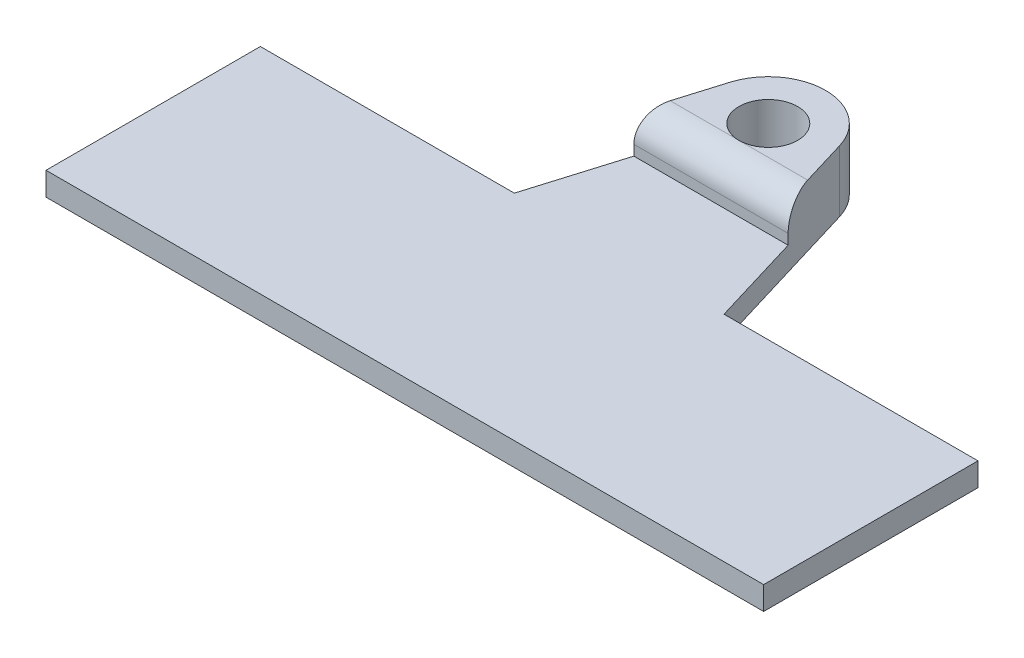
ISO-10303-21;
HEADER;
FILE_DESCRIPTION(('STEP AP214'),'2;1');
FILE_NAME('part.step','',(''),(''),'','','');
FILE_SCHEMA(('AUTOMOTIVE_DESIGN { 1 0 10303 214 1 1 1 1 }'));
ENDSEC;
DATA;
#1=APPLICATION_CONTEXT('core data for automotive mechanical design processes');
#2=APPLICATION_PROTOCOL_DEFINITION('international standard','automotive_design',2000,#1);
#3=PRODUCT_CONTEXT('',#1,'mechanical');
#4=PRODUCT('Part','Part','',(#3));
#5=PRODUCT_RELATED_PRODUCT_CATEGORY('part','',(#4));
#6=PRODUCT_DEFINITION_FORMATION('','',#4);
#7=PRODUCT_DEFINITION_CONTEXT('part definition',#1,'design');
#8=PRODUCT_DEFINITION('design','',#6,#7);
#9=PRODUCT_DEFINITION_SHAPE('','',#8);
#10=(LENGTH_UNIT() NAMED_UNIT(*) SI_UNIT(.MILLI.,.METRE.));
#11=(NAMED_UNIT(*) PLANE_ANGLE_UNIT() SI_UNIT($,.RADIAN.));
#12=(NAMED_UNIT(*) SI_UNIT($,.STERADIAN.) SOLID_ANGLE_UNIT());
#13=UNCERTAINTY_MEASURE_WITH_UNIT(LENGTH_MEASURE(1.E-05),#10,'distance_accuracy_value','');
#14=(GEOMETRIC_REPRESENTATION_CONTEXT(3) GLOBAL_UNCERTAINTY_ASSIGNED_CONTEXT((#13)) GLOBAL_UNIT_ASSIGNED_CONTEXT((#10,
#11,#12)) REPRESENTATION_CONTEXT('',''));
#15=CARTESIAN_POINT('',(0.,0.,0.));
#16=DIRECTION('',(0.,0.,1.));
#17=DIRECTION('',(1.,0.,0.));
#18=AXIS2_PLACEMENT_3D('',#15,#16,#17);
#19=CARTESIAN_POINT('',(-10.3114843961297,6.6,-3.11014044503737));
#20=DIRECTION('',(-0.957398594904213,0.,-0.288769684135018));
#21=DIRECTION('',(-0.288769684135018,0.,0.957398594904213));
#22=AXIS2_PLACEMENT_3D('',#19,#20,#21);
#23=PLANE('',#22);
#24=DIRECTION('',(0.,1.,0.));
#25=VECTOR('',#24,1.);
#26=CARTESIAN_POINT('',(-8.27861415257597,6.60000000000001,-9.85));
#27=LINE('',#26,#25);
#28=CARTESIAN_POINT('',(-8.27861415257597,2.5,-9.85));
#29=VERTEX_POINT('',#28);
#30=CARTESIAN_POINT('',(-8.27861415257597,3.6,-9.85));
#31=VERTEX_POINT('',#30);
#32=EDGE_CURVE('E134',#29,#31,#27,.T.);
#33=ORIENTED_EDGE('',*,*,#32,.T.);
#34=CARTESIAN_POINT('',(-7.37375691023615,3.6,-12.85));
#35=DIRECTION('',(-0.957398594904213,0.,-0.288769684135018));
#36=DIRECTION('',(-0.288769684135018,0.,0.957398594904213));
#37=AXIS2_PLACEMENT_3D('',#34,#35,#36);
#38=ELLIPSE('',#37,3.1334911247704,3.);
#39=CARTESIAN_POINT('',(-7.37375691023613,6.6,-12.85));
#40=VERTEX_POINT('',#39);
#41=EDGE_CURVE('E241',#31,#40,#38,.T.);
#42=ORIENTED_EDGE('',*,*,#41,.T.);
#43=DIRECTION('',(0.288769684135018,0.,-0.957398594904213));
#44=VECTOR('',#43,1.);
#45=CARTESIAN_POINT('',(-10.3114843961297,6.6,-3.11014044503737));
#46=LINE('',#45,#44);
#47=CARTESIAN_POINT('',(-5.88800135866091,6.6,-17.7759335574304));
#48=VERTEX_POINT('',#47);
#49=EDGE_CURVE('E177',#40,#48,#46,.T.);
#50=ORIENTED_EDGE('',*,*,#49,.T.);
#51=DIRECTION('',(0.,-1.,0.));
#52=VECTOR('',#51,1.);
#53=CARTESIAN_POINT('',(-5.88800135866091,6.6,-17.7759335574304));
#54=LINE('',#53,#52);
#55=CARTESIAN_POINT('',(-5.88800135866091,0.,-17.7759335574304));
#56=VERTEX_POINT('',#55);
#57=EDGE_CURVE('E234',#48,#56,#54,.T.);
#58=ORIENTED_EDGE('',*,*,#57,.T.);
#59=DIRECTION('',(0.288769684135018,0.,-0.957398594904213));
#60=VECTOR('',#59,1.);
#61=CARTESIAN_POINT('',(-10.3114843961297,0.,-3.11014044503737));
#62=LINE('',#61,#60);
#63=CARTESIAN_POINT('',(-11.2495620982584,0.,0.));
#64=VERTEX_POINT('',#63);
#65=EDGE_CURVE('E167',#64,#56,#62,.T.);
#66=ORIENTED_EDGE('',*,*,#65,.F.);
#67=DIRECTION('',(0.,-1.,0.));
#68=VECTOR('',#67,1.);
#69=CARTESIAN_POINT('',(-11.2495620982584,6.6,0.));
#70=LINE('',#69,#68);
#71=CARTESIAN_POINT('',(-11.2495620982584,2.5,0.));
#72=VERTEX_POINT('',#71);
#73=EDGE_CURVE('E159',#72,#64,#70,.T.);
#74=ORIENTED_EDGE('',*,*,#73,.F.);
#75=DIRECTION('',(0.288769684135018,0.,-0.957398594904213));
#76=VECTOR('',#75,1.);
#77=CARTESIAN_POINT('',(-10.3114843961297,2.5,-3.11014044503737));
#78=LINE('',#77,#76);
#79=EDGE_CURVE('E150',#72,#29,#78,.T.);
#80=ORIENTED_EDGE('',*,*,#79,.T.);
#81=EDGE_LOOP('',(#33,#42,#50,#58,#66,#74,#80));
#82=FACE_BOUND('',#81,.T.);
#83=ADVANCED_FACE('F46',(#82),#23,.T.);
#84=CARTESIAN_POINT('',(0.,6.6,0.));
#85=DIRECTION('',(0.,0.,-1.));
#86=DIRECTION('',(-1.,0.,0.));
#87=AXIS2_PLACEMENT_3D('',#84,#85,#86);
#88=PLANE('',#87);
#89=DIRECTION('',(0.,-1.,0.));
#90=VECTOR('',#89,1.);
#91=CARTESIAN_POINT('',(-38.5,6.6,0.));
#92=LINE('',#91,#90);
#93=CARTESIAN_POINT('',(-38.5,2.5,0.));
#94=VERTEX_POINT('',#93);
#95=CARTESIAN_POINT('',(-38.5,0.,0.));
#96=VERTEX_POINT('',#95);
#97=EDGE_CURVE('E229',#94,#96,#92,.T.);
#98=ORIENTED_EDGE('',*,*,#97,.F.);
#99=DIRECTION('',(1.,0.,0.));
#100=VECTOR('',#99,1.);
#101=CARTESIAN_POINT('',(0.,2.5,0.));
#102=LINE('',#101,#100);
#103=EDGE_CURVE('E162',#94,#72,#102,.T.);
#104=ORIENTED_EDGE('',*,*,#103,.T.);
#105=ORIENTED_EDGE('',*,*,#73,.T.);
#106=DIRECTION('',(1.,0.,0.));
#107=VECTOR('',#106,1.);
#108=CARTESIAN_POINT('',(0.,0.,0.));
#109=LINE('',#108,#107);
#110=EDGE_CURVE('E191',#96,#64,#109,.T.);
#111=ORIENTED_EDGE('',*,*,#110,.F.);
#112=EDGE_LOOP('',(#98,#104,#105,#111));
#113=FACE_BOUND('',#112,.T.);
#114=ADVANCED_FACE('F274',(#113),#88,.T.);
#115=CARTESIAN_POINT('',(-38.5,6.6,0.));
#116=DIRECTION('',(1.,0.,0.));
#117=DIRECTION('',(0.,0.,-1.));
#118=AXIS2_PLACEMENT_3D('',#115,#116,#117);
#119=PLANE('',#118);
#120=DIRECTION('',(0.,0.,1.));
#121=VECTOR('',#120,1.);
#122=CARTESIAN_POINT('',(-38.5,2.5,0.));
#123=LINE('',#122,#121);
#124=CARTESIAN_POINT('',(-38.5,2.5,23.));
#125=VERTEX_POINT('',#124);
#126=EDGE_CURVE('E169',#94,#125,#123,.T.);
#127=ORIENTED_EDGE('',*,*,#126,.F.);
#128=ORIENTED_EDGE('',*,*,#97,.T.);
#129=DIRECTION('',(0.,0.,1.));
#130=VECTOR('',#129,1.);
#131=CARTESIAN_POINT('',(-38.5,0.,0.));
#132=LINE('',#131,#130);
#133=CARTESIAN_POINT('',(-38.5,0.,23.));
#134=VERTEX_POINT('',#133);
#135=EDGE_CURVE('E195',#96,#134,#132,.T.);
#136=ORIENTED_EDGE('',*,*,#135,.T.);
#137=DIRECTION('',(0.,-1.,0.));
#138=VECTOR('',#137,1.);
#139=CARTESIAN_POINT('',(-38.5,6.6,23.));
#140=LINE('',#139,#138);
#141=EDGE_CURVE('E226',#125,#134,#140,.T.);
#142=ORIENTED_EDGE('',*,*,#141,.F.);
#143=EDGE_LOOP('',(#127,#128,#136,#142));
#144=FACE_BOUND('',#143,.T.);
#145=ADVANCED_FACE('F291',(#144),#119,.F.);
#146=CARTESIAN_POINT('',(38.5,6.6,0.));
#147=DIRECTION('',(1.,0.,0.));
#148=DIRECTION('',(0.,0.,-1.));
#149=AXIS2_PLACEMENT_3D('',#146,#147,#148);
#150=PLANE('',#149);
#151=DIRECTION('',(0.,-1.,0.));
#152=VECTOR('',#151,1.);
#153=CARTESIAN_POINT('',(38.5,6.6,0.));
#154=LINE('',#153,#152);
#155=CARTESIAN_POINT('',(38.5,2.5,0.));
#156=VERTEX_POINT('',#155);
#157=CARTESIAN_POINT('',(38.5,0.,0.));
#158=VERTEX_POINT('',#157);
#159=EDGE_CURVE('E220',#156,#158,#154,.T.);
#160=ORIENTED_EDGE('',*,*,#159,.F.);
#161=DIRECTION('',(0.,0.,1.));
#162=VECTOR('',#161,1.);
#163=CARTESIAN_POINT('',(38.5,2.5,0.));
#164=LINE('',#163,#162);
#165=CARTESIAN_POINT('',(38.5,2.5,23.));
#166=VERTEX_POINT('',#165);
#167=EDGE_CURVE('E264',#156,#166,#164,.T.);
#168=ORIENTED_EDGE('',*,*,#167,.T.);
#169=DIRECTION('',(0.,-1.,0.));
#170=VECTOR('',#169,1.);
#171=CARTESIAN_POINT('',(38.5,6.6,23.));
#172=LINE('',#171,#170);
#173=CARTESIAN_POINT('',(38.5,0.,23.));
#174=VERTEX_POINT('',#173);
#175=EDGE_CURVE('E223',#166,#174,#172,.T.);
#176=ORIENTED_EDGE('',*,*,#175,.T.);
#177=DIRECTION('',(0.,0.,1.));
#178=VECTOR('',#177,1.);
#179=CARTESIAN_POINT('',(38.5,0.,0.));
#180=LINE('',#179,#178);
#181=EDGE_CURVE('E204',#158,#174,#180,.T.);
#182=ORIENTED_EDGE('',*,*,#181,.F.);
#183=EDGE_LOOP('',(#160,#168,#176,#182));
#184=FACE_BOUND('',#183,.T.);
#185=ADVANCED_FACE('F262',(#184),#150,.T.);
#186=DIRECTION('',(0.,-1.,0.));
#187=VECTOR('',#186,1.);
#188=CARTESIAN_POINT('',(11.2495620982584,6.6,0.));
#189=LINE('',#188,#187);
#190=CARTESIAN_POINT('',(11.2495620982584,2.5,0.));
#191=VERTEX_POINT('',#190);
#192=CARTESIAN_POINT('',(11.2495620982584,0.,0.));
#193=VERTEX_POINT('',#192);
#194=EDGE_CURVE('E217',#191,#193,#189,.T.);
#195=ORIENTED_EDGE('',*,*,#194,.F.);
#196=DIRECTION('',(1.,0.,0.));
#197=VECTOR('',#196,1.);
#198=CARTESIAN_POINT('',(0.,2.5,0.));
#199=LINE('',#198,#197);
#200=EDGE_CURVE('E145',#191,#156,#199,.T.);
#201=ORIENTED_EDGE('',*,*,#200,.T.);
#202=ORIENTED_EDGE('',*,*,#159,.T.);
#203=EDGE_CURVE('E196',#193,#158,#109,.T.);
#204=ORIENTED_EDGE('',*,*,#203,.F.);
#205=EDGE_LOOP('',(#195,#201,#202,#204));
#206=FACE_BOUND('',#205,.T.);
#207=ADVANCED_FACE('F257',(#206),#88,.T.);
#208=CARTESIAN_POINT('',(10.3114843961297,6.6,-3.11014044503735));
#209=DIRECTION('',(0.957398594904214,0.,-0.288769684135017));
#210=DIRECTION('',(-0.288769684135017,0.,-0.957398594904214));
#211=AXIS2_PLACEMENT_3D('',#208,#209,#210);
#212=PLANE('',#211);
#213=DIRECTION('',(0.288769684135017,0.,0.957398594904214));
#214=VECTOR('',#213,1.);
#215=CARTESIAN_POINT('',(10.3114843961297,6.6,-3.11014044503735));
#216=LINE('',#215,#214);
#217=CARTESIAN_POINT('',(5.88800135866091,6.6,-17.7759335574304));
#218=VERTEX_POINT('',#217);
#219=CARTESIAN_POINT('',(7.37375691023612,6.6,-12.85));
#220=VERTEX_POINT('',#219);
#221=EDGE_CURVE('E181',#218,#220,#216,.T.);
#222=ORIENTED_EDGE('',*,*,#221,.T.);
#223=CARTESIAN_POINT('',(7.37375691023612,3.6,-12.85));
#224=DIRECTION('',(0.957398594904214,0.,-0.288769684135017));
#225=DIRECTION('',(-0.288769684135017,0.,-0.957398594904214));
#226=AXIS2_PLACEMENT_3D('',#223,#224,#225);
#227=ELLIPSE('',#226,3.1334911247704,3.);
#228=CARTESIAN_POINT('',(8.27861415257595,3.6,-9.85));
#229=VERTEX_POINT('',#228);
#230=EDGE_CURVE('E11',#220,#229,#227,.T.);
#231=ORIENTED_EDGE('',*,*,#230,.T.);
#232=DIRECTION('',(0.,-1.,0.));
#233=VECTOR('',#232,1.);
#234=CARTESIAN_POINT('',(8.27861415257595,6.60000000000001,-9.85));
#235=LINE('',#234,#233);
#236=CARTESIAN_POINT('',(8.27861415257595,2.5,-9.85));
#237=VERTEX_POINT('',#236);
#238=EDGE_CURVE('E146',#229,#237,#235,.T.);
#239=ORIENTED_EDGE('',*,*,#238,.T.);
#240=DIRECTION('',(0.288769684135017,0.,0.957398594904214));
#241=VECTOR('',#240,1.);
#242=CARTESIAN_POINT('',(10.3114843961297,2.5,-3.11014044503735));
#243=LINE('',#242,#241);
#244=EDGE_CURVE('E153',#237,#191,#243,.T.);
#245=ORIENTED_EDGE('',*,*,#244,.T.);
#246=ORIENTED_EDGE('',*,*,#194,.T.);
#247=DIRECTION('',(0.288769684135017,0.,0.957398594904214));
#248=VECTOR('',#247,1.);
#249=CARTESIAN_POINT('',(10.3114843961297,0.,-3.11014044503735));
#250=LINE('',#249,#248);
#251=CARTESIAN_POINT('',(5.88800135866091,0.,-17.7759335574304));
#252=VERTEX_POINT('',#251);
#253=EDGE_CURVE('E208',#252,#193,#250,.T.);
#254=ORIENTED_EDGE('',*,*,#253,.F.);
#255=DIRECTION('',(0.,-1.,0.));
#256=VECTOR('',#255,1.);
#257=CARTESIAN_POINT('',(5.88800135866091,6.6,-17.7759335574304));
#258=LINE('',#257,#256);
#259=EDGE_CURVE('E186',#218,#252,#258,.T.);
#260=ORIENTED_EDGE('',*,*,#259,.F.);
#261=EDGE_LOOP('',(#222,#231,#239,#245,#246,#254,#260));
#262=FACE_BOUND('',#261,.T.);
#263=ADVANCED_FACE('F279',(#262),#212,.T.);
#264=CARTESIAN_POINT('',(0.,6.6,-16.));
#265=DIRECTION('',(0.,-1.,0.));
#266=DIRECTION('',(0.,0.,-1.));
#267=AXIS2_PLACEMENT_3D('',#264,#265,#266);
#268=CYLINDRICAL_SURFACE('',#267,6.15);
#269=CARTESIAN_POINT('',(0.,0.,-16.));
#270=DIRECTION('',(0.,1.,0.));
#271=DIRECTION('',(0.,0.,1.));
#272=AXIS2_PLACEMENT_3D('',#269,#270,#271);
#273=CIRCLE('',#272,6.15);
#274=EDGE_CURVE('E161',#56,#252,#273,.F.);
#275=ORIENTED_EDGE('',*,*,#274,.F.);
#276=ORIENTED_EDGE('',*,*,#57,.F.);
#277=CARTESIAN_POINT('',(0.,6.6,-16.));
#278=DIRECTION('',(0.,1.,0.));
#279=DIRECTION('',(0.,0.,1.));
#280=AXIS2_PLACEMENT_3D('',#277,#278,#279);
#281=CIRCLE('',#280,6.15);
#282=EDGE_CURVE('E173',#48,#218,#281,.F.);
#283=ORIENTED_EDGE('',*,*,#282,.T.);
#284=ORIENTED_EDGE('',*,*,#259,.T.);
#285=EDGE_LOOP('',(#275,#276,#283,#284));
#286=FACE_BOUND('',#285,.T.);
#287=ADVANCED_FACE('F307',(#286),#268,.T.);
#288=CARTESIAN_POINT('',(0.,6.6,23.));
#289=DIRECTION('',(0.,0.,-1.));
#290=DIRECTION('',(-1.,0.,0.));
#291=AXIS2_PLACEMENT_3D('',#288,#289,#290);
#292=PLANE('',#291);
#293=ORIENTED_EDGE('',*,*,#175,.F.);
#294=DIRECTION('',(-1.,0.,0.));
#295=VECTOR('',#294,1.);
#296=CARTESIAN_POINT('',(119.24081509477,2.5,23.));
#297=LINE('',#296,#295);
#298=EDGE_CURVE('E155',#166,#125,#297,.T.);
#299=ORIENTED_EDGE('',*,*,#298,.T.);
#300=ORIENTED_EDGE('',*,*,#141,.T.);
#301=DIRECTION('',(1.,0.,0.));
#302=VECTOR('',#301,1.);
#303=CARTESIAN_POINT('',(0.,0.,23.));
#304=LINE('',#303,#302);
#305=EDGE_CURVE('E200',#134,#174,#304,.T.);
#306=ORIENTED_EDGE('',*,*,#305,.T.);
#307=EDGE_LOOP('',(#293,#299,#300,#306));
#308=FACE_BOUND('',#307,.T.);
#309=ADVANCED_FACE('F267',(#308),#292,.F.);
#310=CARTESIAN_POINT('',(0.,6.6,-16.));
#311=DIRECTION('',(0.,-1.,0.));
#312=DIRECTION('',(0.,0.,-1.));
#313=AXIS2_PLACEMENT_3D('',#310,#311,#312);
#314=CYLINDRICAL_SURFACE('',#313,3.15);
#315=CARTESIAN_POINT('',(0.,6.6,-16.));
#316=DIRECTION('',(0.,1.,0.));
#317=DIRECTION('',(0.,0.,1.));
#318=AXIS2_PLACEMENT_3D('',#315,#316,#317);
#319=CIRCLE('',#318,3.15);
#320=CARTESIAN_POINT('',(0.,6.6,-12.85));
#321=VERTEX_POINT('',#320);
#322=EDGE_CURVE('E184',#321,#321,#319,.T.);
#323=ORIENTED_EDGE('',*,*,#322,.T.);
#324=EDGE_LOOP('',(#323));
#325=FACE_BOUND('',#324,.T.);
#326=CARTESIAN_POINT('',(0.,0.,-16.));
#327=DIRECTION('',(0.,1.,0.));
#328=DIRECTION('',(0.,0.,1.));
#329=AXIS2_PLACEMENT_3D('',#326,#327,#328);
#330=CIRCLE('',#329,3.15);
#331=CARTESIAN_POINT('',(0.,0.,-12.85));
#332=VERTEX_POINT('',#331);
#333=EDGE_CURVE('E178',#332,#332,#330,.T.);
#334=ORIENTED_EDGE('',*,*,#333,.F.);
#335=EDGE_LOOP('',(#334));
#336=FACE_BOUND('',#335,.T.);
#337=ADVANCED_FACE('F313',(#325,#336),#314,.F.);
#338=CARTESIAN_POINT('',(0.,6.6,0.));
#339=DIRECTION('',(0.,1.,0.));
#340=DIRECTION('',(0.,0.,1.));
#341=AXIS2_PLACEMENT_3D('',#338,#339,#340);
#342=PLANE('',#341);
#343=ORIENTED_EDGE('',*,*,#49,.F.);
#344=DIRECTION('',(-1.,0.,0.));
#345=VECTOR('',#344,1.);
#346=CARTESIAN_POINT('',(0.,6.6,-12.85));
#347=LINE('',#346,#345);
#348=EDGE_CURVE('E55',#40,#321,#347,.F.);
#349=ORIENTED_EDGE('',*,*,#348,.T.);
#350=ORIENTED_EDGE('',*,*,#322,.F.);
#351=DIRECTION('',(-1.,0.,0.));
#352=VECTOR('',#351,1.);
#353=CARTESIAN_POINT('',(0.,6.6,-12.85));
#354=LINE('',#353,#352);
#355=EDGE_CURVE('E67',#321,#220,#354,.F.);
#356=ORIENTED_EDGE('',*,*,#355,.T.);
#357=ORIENTED_EDGE('',*,*,#221,.F.);
#358=ORIENTED_EDGE('',*,*,#282,.F.);
#359=EDGE_LOOP('',(#343,#349,#350,#356,#357,#358));
#360=FACE_BOUND('',#359,.T.);
#361=ADVANCED_FACE('F321',(#360),#342,.T.);
#362=CARTESIAN_POINT('',(0.,0.,0.));
#363=DIRECTION('',(0.,1.,0.));
#364=DIRECTION('',(0.,0.,1.));
#365=AXIS2_PLACEMENT_3D('',#362,#363,#364);
#366=PLANE('',#365);
#367=ORIENTED_EDGE('',*,*,#274,.T.);
#368=ORIENTED_EDGE('',*,*,#253,.T.);
#369=ORIENTED_EDGE('',*,*,#203,.T.);
#370=ORIENTED_EDGE('',*,*,#181,.T.);
#371=ORIENTED_EDGE('',*,*,#305,.F.);
#372=ORIENTED_EDGE('',*,*,#135,.F.);
#373=ORIENTED_EDGE('',*,*,#110,.T.);
#374=ORIENTED_EDGE('',*,*,#65,.T.);
#375=EDGE_LOOP('',(#367,#368,#369,#370,#371,#372,#373,#374));
#376=FACE_BOUND('',#375,.T.);
#377=ORIENTED_EDGE('',*,*,#333,.T.);
#378=EDGE_LOOP('',(#377));
#379=FACE_BOUND('',#378,.T.);
#380=ADVANCED_FACE('F250',(#376,#379),#366,.F.);
#381=CARTESIAN_POINT('',(119.24081509477,2.5,23.));
#382=DIRECTION('',(0.,1.,0.));
#383=DIRECTION('',(0.,0.,1.));
#384=AXIS2_PLACEMENT_3D('',#381,#382,#383);
#385=PLANE('',#384);
#386=ORIENTED_EDGE('',*,*,#79,.F.);
#387=ORIENTED_EDGE('',*,*,#103,.F.);
#388=ORIENTED_EDGE('',*,*,#126,.T.);
#389=ORIENTED_EDGE('',*,*,#298,.F.);
#390=ORIENTED_EDGE('',*,*,#167,.F.);
#391=ORIENTED_EDGE('',*,*,#200,.F.);
#392=ORIENTED_EDGE('',*,*,#244,.F.);
#393=DIRECTION('',(-1.,0.,0.));
#394=VECTOR('',#393,1.);
#395=CARTESIAN_POINT('',(119.24081509477,2.5,-9.85));
#396=LINE('',#395,#394);
#397=EDGE_CURVE('E138',#237,#29,#396,.T.);
#398=ORIENTED_EDGE('',*,*,#397,.T.);
#399=EDGE_LOOP('',(#386,#387,#388,#389,#390,#391,#392,#398));
#400=FACE_BOUND('',#399,.T.);
#401=ADVANCED_FACE('F149',(#400),#385,.T.);
#402=CARTESIAN_POINT('',(119.24081509477,2.5,-9.85));
#403=DIRECTION('',(0.,0.,1.));
#404=DIRECTION('',(0.,-1.,0.));
#405=AXIS2_PLACEMENT_3D('',#402,#403,#404);
#406=PLANE('',#405);
#407=ORIENTED_EDGE('',*,*,#238,.F.);
#408=DIRECTION('',(-1.,0.,0.));
#409=VECTOR('',#408,1.);
#410=CARTESIAN_POINT('',(119.24081509477,3.6,-9.85));
#411=LINE('',#410,#409);
#412=EDGE_CURVE('E141',#229,#31,#411,.T.);
#413=ORIENTED_EDGE('',*,*,#412,.T.);
#414=ORIENTED_EDGE('',*,*,#32,.F.);
#415=ORIENTED_EDGE('',*,*,#397,.F.);
#416=EDGE_LOOP('',(#407,#413,#414,#415));
#417=FACE_BOUND('',#416,.T.);
#418=ADVANCED_FACE('F137',(#417),#406,.T.);
#419=CARTESIAN_POINT('',(119.24081509477,3.6,-12.85));
#420=DIRECTION('',(-1.,0.,0.));
#421=DIRECTION('',(0.,0.,1.));
#422=AXIS2_PLACEMENT_3D('',#419,#420,#421);
#423=CYLINDRICAL_SURFACE('',#422,3.);
#424=ORIENTED_EDGE('',*,*,#355,.F.);
#425=ORIENTED_EDGE('',*,*,#348,.F.);
#426=ORIENTED_EDGE('',*,*,#41,.F.);
#427=ORIENTED_EDGE('',*,*,#412,.F.);
#428=ORIENTED_EDGE('',*,*,#230,.F.);
#429=EDGE_LOOP('',(#424,#425,#426,#427,#428));
#430=FACE_BOUND('',#429,.T.);
#431=ADVANCED_FACE('F48',(#430),#423,.T.);
#432=CLOSED_SHELL('',(#83,#114,#145,#185,#207,#263,#287,#309,#337,#361,#380,#401,#418,#431));
#433=MANIFOLD_SOLID_BREP('B2',#432);
#434=ADVANCED_BREP_SHAPE_REPRESENTATION('',(#18,#433),#14);
#435=SHAPE_DEFINITION_REPRESENTATION(#9,#434);
ENDSEC;
END-ISO-10303-21;
